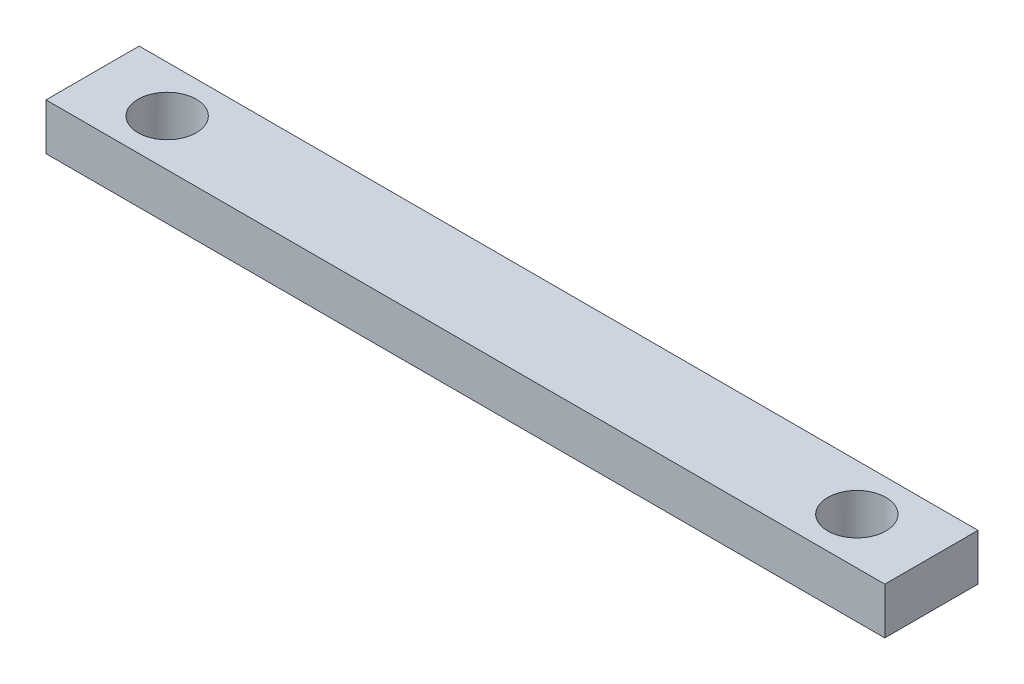
ISO-10303-21;
HEADER;
FILE_DESCRIPTION(('STEP AP214'),'2;1');
FILE_NAME('part.step','',(''),(''),'','','');
FILE_SCHEMA(('AUTOMOTIVE_DESIGN { 1 0 10303 214 1 1 1 1 }'));
ENDSEC;
DATA;
#1=APPLICATION_CONTEXT('core data for automotive mechanical design processes');
#2=APPLICATION_PROTOCOL_DEFINITION('international standard','automotive_design',2000,#1);
#3=PRODUCT_CONTEXT('',#1,'mechanical');
#4=PRODUCT('Part','Part','',(#3));
#5=PRODUCT_RELATED_PRODUCT_CATEGORY('part','',(#4));
#6=PRODUCT_DEFINITION_FORMATION('','',#4);
#7=PRODUCT_DEFINITION_CONTEXT('part definition',#1,'design');
#8=PRODUCT_DEFINITION('design','',#6,#7);
#9=PRODUCT_DEFINITION_SHAPE('','',#8);
#10=(LENGTH_UNIT() NAMED_UNIT(*) SI_UNIT(.MILLI.,.METRE.));
#11=(NAMED_UNIT(*) PLANE_ANGLE_UNIT() SI_UNIT($,.RADIAN.));
#12=(NAMED_UNIT(*) SI_UNIT($,.STERADIAN.) SOLID_ANGLE_UNIT());
#13=UNCERTAINTY_MEASURE_WITH_UNIT(LENGTH_MEASURE(1.E-05),#10,'distance_accuracy_value','');
#14=(GEOMETRIC_REPRESENTATION_CONTEXT(3) GLOBAL_UNCERTAINTY_ASSIGNED_CONTEXT((#13)) GLOBAL_UNIT_ASSIGNED_CONTEXT((#10,
#11,#12)) REPRESENTATION_CONTEXT('',''));
#15=CARTESIAN_POINT('',(0.,0.,0.));
#16=DIRECTION('',(0.,0.,1.));
#17=DIRECTION('',(1.,0.,0.));
#18=AXIS2_PLACEMENT_3D('',#15,#16,#17);
#19=CARTESIAN_POINT('',(57.15,6.35,6.35));
#20=DIRECTION('',(-1.,0.,0.));
#21=DIRECTION('',(0.,0.,1.));
#22=AXIS2_PLACEMENT_3D('',#19,#20,#21);
#23=PLANE('',#22);
#24=DIRECTION('',(0.,0.,-1.));
#25=VECTOR('',#24,1.);
#26=CARTESIAN_POINT('',(57.15,0.,6.35));
#27=LINE('',#26,#25);
#28=CARTESIAN_POINT('',(57.15,0.,6.35));
#29=VERTEX_POINT('',#28);
#30=CARTESIAN_POINT('',(57.15,0.,-6.35));
#31=VERTEX_POINT('',#30);
#32=EDGE_CURVE('E113',#29,#31,#27,.T.);
#33=ORIENTED_EDGE('',*,*,#32,.T.);
#34=DIRECTION('',(0.,-1.,0.));
#35=VECTOR('',#34,1.);
#36=CARTESIAN_POINT('',(57.15,6.35,-6.35));
#37=LINE('',#36,#35);
#38=CARTESIAN_POINT('',(57.15,6.35,-6.35));
#39=VERTEX_POINT('',#38);
#40=EDGE_CURVE('E11',#39,#31,#37,.T.);
#41=ORIENTED_EDGE('',*,*,#40,.F.);
#42=DIRECTION('',(0.,0.,-1.));
#43=VECTOR('',#42,1.);
#44=CARTESIAN_POINT('',(57.15,6.35,6.35));
#45=LINE('',#44,#43);
#46=CARTESIAN_POINT('',(57.15,6.35,6.35));
#47=VERTEX_POINT('',#46);
#48=EDGE_CURVE('E97',#47,#39,#45,.T.);
#49=ORIENTED_EDGE('',*,*,#48,.F.);
#50=DIRECTION('',(0.,-1.,0.));
#51=VECTOR('',#50,1.);
#52=CARTESIAN_POINT('',(57.15,6.35,6.35));
#53=LINE('',#52,#51);
#54=EDGE_CURVE('E109',#47,#29,#53,.T.);
#55=ORIENTED_EDGE('',*,*,#54,.T.);
#56=EDGE_LOOP('',(#33,#41,#49,#55));
#57=FACE_BOUND('',#56,.T.);
#58=ADVANCED_FACE('F45',(#57),#23,.F.);
#59=CARTESIAN_POINT('',(-57.15,6.35,-6.35));
#60=DIRECTION('',(0.,0.,1.));
#61=DIRECTION('',(1.,0.,0.));
#62=AXIS2_PLACEMENT_3D('',#59,#60,#61);
#63=PLANE('',#62);
#64=DIRECTION('',(-1.,0.,0.));
#65=VECTOR('',#64,1.);
#66=CARTESIAN_POINT('',(-57.15,0.,-6.35));
#67=LINE('',#66,#65);
#68=CARTESIAN_POINT('',(-57.15,0.,-6.35));
#69=VERTEX_POINT('',#68);
#70=EDGE_CURVE('E102',#31,#69,#67,.T.);
#71=ORIENTED_EDGE('',*,*,#70,.T.);
#72=DIRECTION('',(0.,-1.,0.));
#73=VECTOR('',#72,1.);
#74=CARTESIAN_POINT('',(-57.15,6.35,-6.35));
#75=LINE('',#74,#73);
#76=CARTESIAN_POINT('',(-57.15,6.35,-6.35));
#77=VERTEX_POINT('',#76);
#78=EDGE_CURVE('E54',#77,#69,#75,.T.);
#79=ORIENTED_EDGE('',*,*,#78,.F.);
#80=DIRECTION('',(-1.,0.,0.));
#81=VECTOR('',#80,1.);
#82=CARTESIAN_POINT('',(-57.15,6.35,-6.35));
#83=LINE('',#82,#81);
#84=EDGE_CURVE('E92',#39,#77,#83,.T.);
#85=ORIENTED_EDGE('',*,*,#84,.F.);
#86=ORIENTED_EDGE('',*,*,#40,.T.);
#87=EDGE_LOOP('',(#71,#79,#85,#86));
#88=FACE_BOUND('',#87,.T.);
#89=ADVANCED_FACE('F101',(#88),#63,.F.);
#90=CARTESIAN_POINT('',(-57.15,6.35,6.35));
#91=DIRECTION('',(1.,0.,0.));
#92=DIRECTION('',(0.,0.,-1.));
#93=AXIS2_PLACEMENT_3D('',#90,#91,#92);
#94=PLANE('',#93);
#95=DIRECTION('',(0.,0.,1.));
#96=VECTOR('',#95,1.);
#97=CARTESIAN_POINT('',(-57.15,0.,6.35));
#98=LINE('',#97,#96);
#99=CARTESIAN_POINT('',(-57.15,0.,6.35));
#100=VERTEX_POINT('',#99);
#101=EDGE_CURVE('E79',#69,#100,#98,.T.);
#102=ORIENTED_EDGE('',*,*,#101,.T.);
#103=DIRECTION('',(0.,-1.,0.));
#104=VECTOR('',#103,1.);
#105=CARTESIAN_POINT('',(-57.15,6.35,6.35));
#106=LINE('',#105,#104);
#107=CARTESIAN_POINT('',(-57.15,6.35,6.35));
#108=VERTEX_POINT('',#107);
#109=EDGE_CURVE('E104',#108,#100,#106,.T.);
#110=ORIENTED_EDGE('',*,*,#109,.F.);
#111=DIRECTION('',(0.,0.,1.));
#112=VECTOR('',#111,1.);
#113=CARTESIAN_POINT('',(-57.15,6.35,6.35));
#114=LINE('',#113,#112);
#115=EDGE_CURVE('E95',#77,#108,#114,.T.);
#116=ORIENTED_EDGE('',*,*,#115,.F.);
#117=ORIENTED_EDGE('',*,*,#78,.T.);
#118=EDGE_LOOP('',(#102,#110,#116,#117));
#119=FACE_BOUND('',#118,.T.);
#120=ADVANCED_FACE('F105',(#119),#94,.F.);
#121=CARTESIAN_POINT('',(-57.15,6.35,6.35));
#122=DIRECTION('',(0.,0.,-1.));
#123=DIRECTION('',(-1.,0.,0.));
#124=AXIS2_PLACEMENT_3D('',#121,#122,#123);
#125=PLANE('',#124);
#126=DIRECTION('',(1.,0.,0.));
#127=VECTOR('',#126,1.);
#128=CARTESIAN_POINT('',(-57.15,0.,6.35));
#129=LINE('',#128,#127);
#130=EDGE_CURVE('E85',#100,#29,#129,.T.);
#131=ORIENTED_EDGE('',*,*,#130,.T.);
#132=ORIENTED_EDGE('',*,*,#54,.F.);
#133=DIRECTION('',(1.,0.,0.));
#134=VECTOR('',#133,1.);
#135=CARTESIAN_POINT('',(-57.15,6.35,6.35));
#136=LINE('',#135,#134);
#137=EDGE_CURVE('E62',#108,#47,#136,.T.);
#138=ORIENTED_EDGE('',*,*,#137,.F.);
#139=ORIENTED_EDGE('',*,*,#109,.T.);
#140=EDGE_LOOP('',(#131,#132,#138,#139));
#141=FACE_BOUND('',#140,.T.);
#142=ADVANCED_FACE('F127',(#141),#125,.F.);
#143=CARTESIAN_POINT('',(0.,6.35,0.));
#144=DIRECTION('',(0.,-1.,0.));
#145=DIRECTION('',(0.,0.,-1.));
#146=AXIS2_PLACEMENT_3D('',#143,#144,#145);
#147=PLANE('',#146);
#148=CARTESIAN_POINT('',(-46.99,6.35,0.));
#149=DIRECTION('',(0.,1.,0.));
#150=DIRECTION('',(0.,0.,1.));
#151=AXIS2_PLACEMENT_3D('',#148,#149,#150);
#152=CIRCLE('',#151,3.96875);
#153=CARTESIAN_POINT('',(-46.99,6.35,3.96875));
#154=VERTEX_POINT('',#153);
#155=EDGE_CURVE('E145',#154,#154,#152,.T.);
#156=ORIENTED_EDGE('',*,*,#155,.F.);
#157=EDGE_LOOP('',(#156));
#158=FACE_BOUND('',#157,.T.);
#159=CARTESIAN_POINT('',(46.99,6.35,0.));
#160=DIRECTION('',(0.,1.,0.));
#161=DIRECTION('',(0.,0.,1.));
#162=AXIS2_PLACEMENT_3D('',#159,#160,#161);
#163=CIRCLE('',#162,3.96875);
#164=CARTESIAN_POINT('',(46.99,6.35,3.96875));
#165=VERTEX_POINT('',#164);
#166=EDGE_CURVE('E137',#165,#165,#163,.T.);
#167=ORIENTED_EDGE('',*,*,#166,.F.);
#168=EDGE_LOOP('',(#167));
#169=FACE_BOUND('',#168,.T.);
#170=ORIENTED_EDGE('',*,*,#48,.T.);
#171=ORIENTED_EDGE('',*,*,#84,.T.);
#172=ORIENTED_EDGE('',*,*,#115,.T.);
#173=ORIENTED_EDGE('',*,*,#137,.T.);
#174=EDGE_LOOP('',(#170,#171,#172,#173));
#175=FACE_BOUND('',#174,.T.);
#176=ADVANCED_FACE('F93',(#158,#169,#175),#147,.F.);
#177=CARTESIAN_POINT('',(0.,0.,0.));
#178=DIRECTION('',(0.,-1.,0.));
#179=DIRECTION('',(0.,0.,-1.));
#180=AXIS2_PLACEMENT_3D('',#177,#178,#179);
#181=PLANE('',#180);
#182=CARTESIAN_POINT('',(-46.99,0.,0.));
#183=DIRECTION('',(0.,-1.,0.));
#184=DIRECTION('',(0.,0.,-1.));
#185=AXIS2_PLACEMENT_3D('',#182,#183,#184);
#186=CIRCLE('',#185,3.96875);
#187=CARTESIAN_POINT('',(-46.99,0.,-3.96875));
#188=VERTEX_POINT('',#187);
#189=EDGE_CURVE('E141',#188,#188,#186,.T.);
#190=ORIENTED_EDGE('',*,*,#189,.F.);
#191=EDGE_LOOP('',(#190));
#192=FACE_BOUND('',#191,.T.);
#193=CARTESIAN_POINT('',(46.99,0.,0.));
#194=DIRECTION('',(0.,-1.,0.));
#195=DIRECTION('',(0.,0.,-1.));
#196=AXIS2_PLACEMENT_3D('',#193,#194,#195);
#197=CIRCLE('',#196,3.96875);
#198=CARTESIAN_POINT('',(46.99,0.,-3.96875));
#199=VERTEX_POINT('',#198);
#200=EDGE_CURVE('E117',#199,#199,#197,.T.);
#201=ORIENTED_EDGE('',*,*,#200,.F.);
#202=EDGE_LOOP('',(#201));
#203=FACE_BOUND('',#202,.T.);
#204=ORIENTED_EDGE('',*,*,#32,.F.);
#205=ORIENTED_EDGE('',*,*,#130,.F.);
#206=ORIENTED_EDGE('',*,*,#101,.F.);
#207=ORIENTED_EDGE('',*,*,#70,.F.);
#208=EDGE_LOOP('',(#204,#205,#206,#207));
#209=FACE_BOUND('',#208,.T.);
#210=ADVANCED_FACE('F130',(#192,#203,#209),#181,.T.);
#211=CARTESIAN_POINT('',(46.99,6.35,0.));
#212=DIRECTION('',(0.,1.,0.));
#213=DIRECTION('',(0.,0.,1.));
#214=AXIS2_PLACEMENT_3D('',#211,#212,#213);
#215=CYLINDRICAL_SURFACE('',#214,3.96875);
#216=ORIENTED_EDGE('',*,*,#200,.T.);
#217=EDGE_LOOP('',(#216));
#218=FACE_BOUND('',#217,.T.);
#219=ORIENTED_EDGE('',*,*,#166,.T.);
#220=EDGE_LOOP('',(#219));
#221=FACE_BOUND('',#220,.T.);
#222=ADVANCED_FACE('F157',(#218,#221),#215,.F.);
#223=CARTESIAN_POINT('',(-46.99,6.35,0.));
#224=DIRECTION('',(0.,1.,0.));
#225=DIRECTION('',(0.,0.,1.));
#226=AXIS2_PLACEMENT_3D('',#223,#224,#225);
#227=CYLINDRICAL_SURFACE('',#226,3.96875);
#228=ORIENTED_EDGE('',*,*,#189,.T.);
#229=EDGE_LOOP('',(#228));
#230=FACE_BOUND('',#229,.T.);
#231=ORIENTED_EDGE('',*,*,#155,.T.);
#232=EDGE_LOOP('',(#231));
#233=FACE_BOUND('',#232,.T.);
#234=ADVANCED_FACE('F150',(#230,#233),#227,.F.);
#235=CLOSED_SHELL('',(#58,#89,#120,#142,#176,#210,#222,#234));
#236=MANIFOLD_SOLID_BREP('B2',#235);
#237=ADVANCED_BREP_SHAPE_REPRESENTATION('',(#18,#236),#14);
#238=SHAPE_DEFINITION_REPRESENTATION(#9,#237);
ENDSEC;
END-ISO-10303-21;
